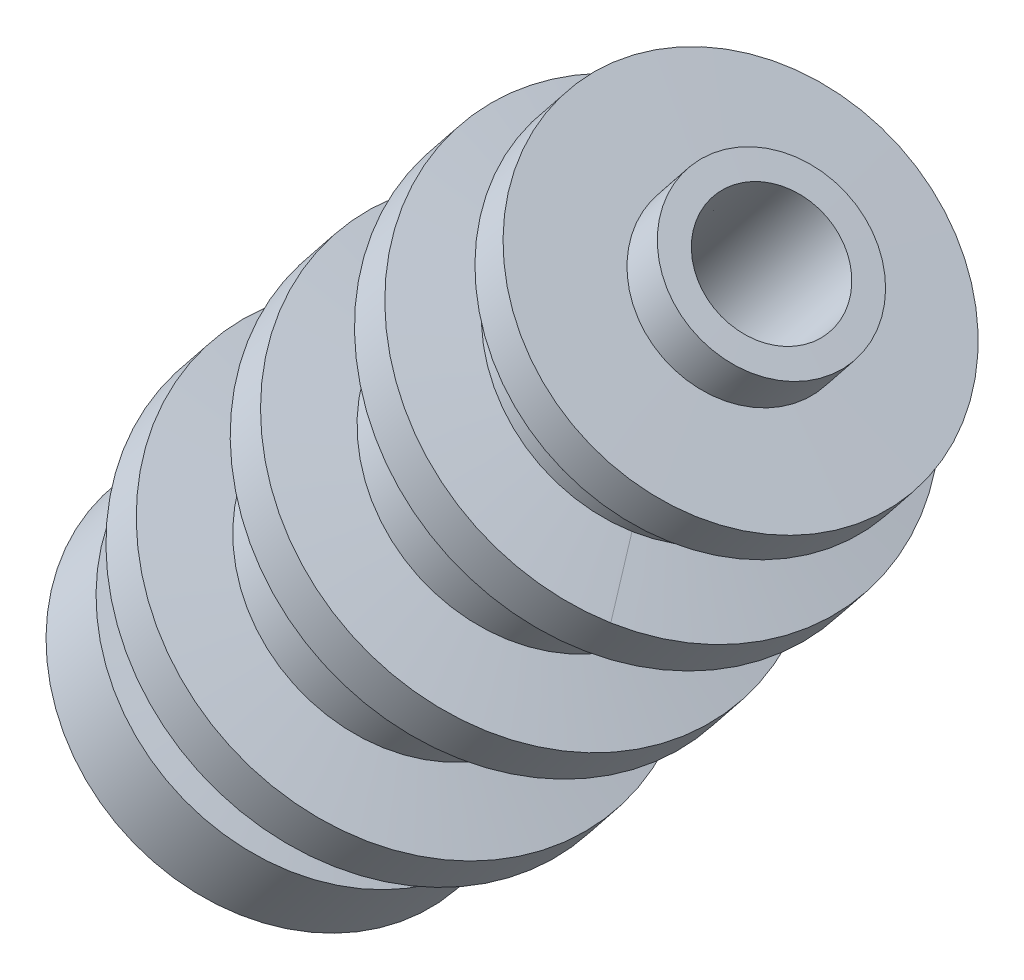
ISO-10303-21;
HEADER;
FILE_DESCRIPTION(('STEP AP214'),'2;1');
FILE_NAME('part.step','',(''),(''),'','','');
FILE_SCHEMA(('AUTOMOTIVE_DESIGN { 1 0 10303 214 1 1 1 1 }'));
ENDSEC;
DATA;
#1=APPLICATION_CONTEXT('core data for automotive mechanical design processes');
#2=APPLICATION_PROTOCOL_DEFINITION('international standard','automotive_design',2000,#1);
#3=PRODUCT_CONTEXT('',#1,'mechanical');
#4=PRODUCT('Part','Part','',(#3));
#5=PRODUCT_RELATED_PRODUCT_CATEGORY('part','',(#4));
#6=PRODUCT_DEFINITION_FORMATION('','',#4);
#7=PRODUCT_DEFINITION_CONTEXT('part definition',#1,'design');
#8=PRODUCT_DEFINITION('design','',#6,#7);
#9=PRODUCT_DEFINITION_SHAPE('','',#8);
#10=(LENGTH_UNIT() NAMED_UNIT(*) SI_UNIT(.MILLI.,.METRE.));
#11=(NAMED_UNIT(*) PLANE_ANGLE_UNIT() SI_UNIT($,.RADIAN.));
#12=(NAMED_UNIT(*) SI_UNIT($,.STERADIAN.) SOLID_ANGLE_UNIT());
#13=UNCERTAINTY_MEASURE_WITH_UNIT(LENGTH_MEASURE(1.E-05),#10,'distance_accuracy_value','');
#14=(GEOMETRIC_REPRESENTATION_CONTEXT(3) GLOBAL_UNCERTAINTY_ASSIGNED_CONTEXT((#13)) GLOBAL_UNIT_ASSIGNED_CONTEXT((#10,
#11,#12)) REPRESENTATION_CONTEXT('',''));
#15=CARTESIAN_POINT('',(0.,0.,0.));
#16=DIRECTION('',(0.,0.,1.));
#17=DIRECTION('',(1.,0.,0.));
#18=AXIS2_PLACEMENT_3D('',#15,#16,#17);
#19=CARTESIAN_POINT('',(-18.608083128768,15.1592131152266,0.));
#20=DIRECTION('',(0.623489801858733,0.78183148246803,0.));
#21=DIRECTION('',(-0.78183148246803,0.623489801858733,0.));
#22=AXIS2_PLACEMENT_3D('',#19,#20,#21);
#23=CYLINDRICAL_SURFACE('',#22,4.5);
#24=CARTESIAN_POINT('',(-19.0757004801884,14.5728395033425,0.));
#25=DIRECTION('',(0.623489801858733,0.78183148246803,0.));
#26=DIRECTION('',(-0.515541201884236,0.411130389375128,-0.751790577283337));
#27=AXIS2_PLACEMENT_3D('',#24,#25,#26);
#28=CIRCLE('',#27,4.49999999999749);
#29=CARTESIAN_POINT('',(-21.3956358886662,16.4229262555295,-3.38305759777313));
#30=VERTEX_POINT('',#29);
#31=EDGE_CURVE('E89',#30,#30,#28,.F.);
#32=ORIENTED_EDGE('',*,*,#31,.F.);
#33=EDGE_LOOP('',(#32));
#34=FACE_BOUND('',#33,.T.);
#35=CARTESIAN_POINT('',(-18.4522106782915,15.3546709858585,0.));
#36=DIRECTION('',(-0.623489801858733,-0.78183148246803,0.));
#37=DIRECTION('',(0.515541201881442,-0.411130389372898,0.751790577286472));
#38=AXIS2_PLACEMENT_3D('',#35,#36,#37);
#39=CIRCLE('',#38,4.50000000005434);
#40=CARTESIAN_POINT('',(-16.132275269797,13.5045842336581,3.38305759782998));
#41=VERTEX_POINT('',#40);
#42=EDGE_CURVE('E88',#41,#41,#39,.F.);
#43=ORIENTED_EDGE('',*,*,#42,.F.);
#44=EDGE_LOOP('',(#43));
#45=FACE_BOUND('',#44,.T.);
#46=ADVANCED_FACE('F17',(#34,#45),#23,.T.);
#47=CARTESIAN_POINT('',(-19.0757004801884,14.5728395033425,0.));
#48=DIRECTION('',(0.623489801858733,0.78183148246803,0.));
#49=DIRECTION('',(-0.78183148246803,0.623489801858733,0.));
#50=AXIS2_PLACEMENT_3D('',#47,#48,#49);
#51=CONICAL_SURFACE('',#50,4.49999999999749,1.48352986420031);
#52=ORIENTED_EDGE('',*,*,#31,.T.);
#53=EDGE_LOOP('',(#52));
#54=FACE_BOUND('',#53,.T.);
#55=CARTESIAN_POINT('',(-19.1575229143921,14.4702374161201,0.));
#56=DIRECTION('',(0.623489801858733,0.78183148246803,0.));
#57=DIRECTION('',(-0.78183148246803,0.623489801858733,0.));
#58=AXIS2_PLACEMENT_3D('',#55,#56,#57);
#59=CIRCLE('',#58,3.);
#60=CARTESIAN_POINT('',(-21.5030173617962,16.3407068216964,0.));
#61=VERTEX_POINT('',#60);
#62=EDGE_CURVE('E83',#61,#61,#59,.F.);
#63=ORIENTED_EDGE('',*,*,#62,.F.);
#64=EDGE_LOOP('',(#63));
#65=FACE_BOUND('',#64,.T.);
#66=ADVANCED_FACE('F347',(#54,#65),#51,.T.);
#67=CARTESIAN_POINT('',(-18.4522106783027,15.3546709858444,0.));
#68=DIRECTION('',(-0.623489801858733,-0.78183148246803,0.));
#69=DIRECTION('',(0.78183148246803,-0.623489801858733,0.));
#70=AXIS2_PLACEMENT_3D('',#67,#68,#69);
#71=CONICAL_SURFACE('',#70,4.50000000028789,1.48352986420075);
#72=CARTESIAN_POINT('',(-18.3703882440733,15.457273073099,0.));
#73=DIRECTION('',(0.623489801858733,0.78183148246803,0.));
#74=DIRECTION('',(-0.78183148246803,0.623489801858733,0.));
#75=AXIS2_PLACEMENT_3D('',#72,#73,#74);
#76=CIRCLE('',#75,3.);
#77=CARTESIAN_POINT('',(-20.7158826914774,17.3277424786752,0.));
#78=VERTEX_POINT('',#77);
#79=EDGE_CURVE('E80',#78,#78,#76,.T.);
#80=ORIENTED_EDGE('',*,*,#79,.F.);
#81=EDGE_LOOP('',(#80));
#82=FACE_BOUND('',#81,.T.);
#83=ORIENTED_EDGE('',*,*,#42,.T.);
#84=EDGE_LOOP('',(#83));
#85=FACE_BOUND('',#84,.T.);
#86=ADVANCED_FACE('F338',(#82,#85),#71,.T.);
#87=CARTESIAN_POINT('',(-21.3202637668535,11.7582461664907,0.));
#88=DIRECTION('',(0.623489801858733,0.78183148246803,0.));
#89=DIRECTION('',(-0.78183148246803,0.623489801858733,0.));
#90=AXIS2_PLACEMENT_3D('',#87,#88,#89);
#91=CYLINDRICAL_SURFACE('',#90,3.);
#92=ORIENTED_EDGE('',*,*,#62,.T.);
#93=EDGE_LOOP('',(#92));
#94=FACE_BOUND('',#93,.T.);
#95=CARTESIAN_POINT('',(-20.9266964316644,12.2517639950174,0.));
#96=DIRECTION('',(-0.623489801858733,-0.78183148246803,0.));
#97=DIRECTION('',(0.515541201890065,-0.411130389379777,0.751790577276798));
#98=AXIS2_PLACEMENT_3D('',#95,#96,#97);
#99=CIRCLE('',#98,3.00000000002442);
#100=CARTESIAN_POINT('',(-19.3800728259816,11.018372826868,2.25537173184875));
#101=VERTEX_POINT('',#100);
#102=EDGE_CURVE('E77',#101,#101,#99,.T.);
#103=ORIENTED_EDGE('',*,*,#102,.F.);
#104=EDGE_LOOP('',(#103));
#105=FACE_BOUND('',#104,.T.);
#106=ADVANCED_FACE('F329',(#94,#105),#91,.T.);
#107=CARTESIAN_POINT('',(-16.2076473916119,18.1692643227285,0.));
#108=DIRECTION('',(0.623489801858733,0.78183148246803,0.));
#109=DIRECTION('',(-0.78183148246803,0.623489801858733,0.));
#110=AXIS2_PLACEMENT_3D('',#107,#108,#109);
#111=CYLINDRICAL_SURFACE('',#110,3.);
#112=ORIENTED_EDGE('',*,*,#79,.T.);
#113=EDGE_LOOP('',(#112));
#114=FACE_BOUND('',#113,.T.);
#115=CARTESIAN_POINT('',(-16.6012147267878,17.6757464942183,0.));
#116=DIRECTION('',(0.623489801858733,0.78183148246803,0.));
#117=DIRECTION('',(-0.515541201892135,0.411130389381426,-0.751790577274476));
#118=AXIS2_PLACEMENT_3D('',#115,#116,#117);
#119=CIRCLE('',#118,3.00000000003368);
#120=CARTESIAN_POINT('',(-18.1478383324816,18.9091376623765,-2.25537173184875));
#121=VERTEX_POINT('',#120);
#122=EDGE_CURVE('E74',#121,#121,#119,.T.);
#123=ORIENTED_EDGE('',*,*,#122,.F.);
#124=EDGE_LOOP('',(#123));
#125=FACE_BOUND('',#124,.T.);
#126=ADVANCED_FACE('F320',(#114,#125),#111,.T.);
#127=CARTESIAN_POINT('',(-21.0085188658923,12.1491619077646,0.));
#128=DIRECTION('',(-0.623489801858734,-0.78183148246803,0.));
#129=DIRECTION('',(0.78183148246803,-0.623489801858733,0.));
#130=AXIS2_PLACEMENT_3D('',#127,#128,#129);
#131=CONICAL_SURFACE('',#130,4.50000000001816,1.48352986420031);
#132=CARTESIAN_POINT('',(-21.0085188659241,12.1491619077247,0.));
#133=DIRECTION('',(0.623489801858733,0.78183148246803,0.));
#134=DIRECTION('',(-0.78183148246803,0.623489801858733,0.));
#135=AXIS2_PLACEMENT_3D('',#132,#133,#134);
#136=CIRCLE('',#135,4.5);
#137=CARTESIAN_POINT('',(-24.5267605370303,14.954866016089,0.));
#138=VERTEX_POINT('',#137);
#139=EDGE_CURVE('E71',#138,#138,#136,.F.);
#140=ORIENTED_EDGE('',*,*,#139,.F.);
#141=EDGE_LOOP('',(#140));
#142=FACE_BOUND('',#141,.T.);
#143=ORIENTED_EDGE('',*,*,#102,.T.);
#144=EDGE_LOOP('',(#143));
#145=FACE_BOUND('',#144,.T.);
#146=ADVANCED_FACE('F311',(#142,#145),#131,.T.);
#147=CARTESIAN_POINT('',(-16.5193922925487,17.7783485814851,0.));
#148=DIRECTION('',(0.623489801858733,0.781831482468031,0.));
#149=DIRECTION('',(-0.78183148246803,0.623489801858733,0.));
#150=AXIS2_PLACEMENT_3D('',#147,#148,#149);
#151=CONICAL_SURFACE('',#150,4.50000000030371,1.48352986422428);
#152=ORIENTED_EDGE('',*,*,#122,.T.);
#153=EDGE_LOOP('',(#152));
#154=FACE_BOUND('',#153,.T.);
#155=CARTESIAN_POINT('',(-16.5193922925413,17.7783485814945,0.));
#156=DIRECTION('',(0.623489801858733,0.78183148246803,0.));
#157=DIRECTION('',(-0.78183148246803,0.623489801858733,0.));
#158=AXIS2_PLACEMENT_3D('',#155,#156,#157);
#159=CIRCLE('',#158,4.5);
#160=CARTESIAN_POINT('',(-20.0376339636474,20.5840526898588,0.));
#161=VERTEX_POINT('',#160);
#162=EDGE_CURVE('E68',#161,#161,#159,.T.);
#163=ORIENTED_EDGE('',*,*,#162,.F.);
#164=EDGE_LOOP('',(#163));
#165=FACE_BOUND('',#164,.T.);
#166=ADVANCED_FACE('F302',(#154,#165),#151,.T.);
#167=CARTESIAN_POINT('',(-21.3202637668535,11.7582461664907,0.));
#168=DIRECTION('',(0.623489801858733,0.78183148246803,0.));
#169=DIRECTION('',(-0.78183148246803,0.623489801858733,0.));
#170=AXIS2_PLACEMENT_3D('',#167,#168,#169);
#171=CYLINDRICAL_SURFACE('',#170,4.5);
#172=ORIENTED_EDGE('',*,*,#139,.T.);
#173=EDGE_LOOP('',(#172));
#174=FACE_BOUND('',#173,.T.);
#175=CARTESIAN_POINT('',(-21.6320086677892,11.3673304252487,0.));
#176=DIRECTION('',(0.623489801858733,0.78183148246803,0.));
#177=DIRECTION('',(-0.515541201878362,0.411130389370444,-0.751790577289926));
#178=AXIS2_PLACEMENT_3D('',#175,#176,#177);
#179=CIRCLE('',#178,4.50000000003367);
#180=CARTESIAN_POINT('',(-23.9519440762592,13.2174171774295,-3.38305759782998));
#181=VERTEX_POINT('',#180);
#182=EDGE_CURVE('E51',#181,#181,#179,.F.);
#183=ORIENTED_EDGE('',*,*,#182,.F.);
#184=EDGE_LOOP('',(#183));
#185=FACE_BOUND('',#184,.T.);
#186=ADVANCED_FACE('F293',(#174,#185),#171,.T.);
#187=CARTESIAN_POINT('',(-16.2076473916119,18.1692643227285,0.));
#188=DIRECTION('',(0.623489801858733,0.78183148246803,0.));
#189=DIRECTION('',(-0.78183148246803,0.623489801858733,0.));
#190=AXIS2_PLACEMENT_3D('',#187,#188,#189);
#191=CYLINDRICAL_SURFACE('',#190,4.5);
#192=ORIENTED_EDGE('',*,*,#162,.T.);
#193=EDGE_LOOP('',(#192));
#194=FACE_BOUND('',#193,.T.);
#195=CARTESIAN_POINT('',(-15.8959024906907,18.5601800639523,0.));
#196=DIRECTION('',(-0.623489801858733,-0.78183148246803,0.));
#197=DIRECTION('',(0.515541201890256,-0.411130389379927,0.751790577276584));
#198=AXIS2_PLACEMENT_3D('',#195,#196,#197);
#199=CIRCLE('',#198,4.49999999996231);
#200=CARTESIAN_POINT('',(-13.5759670822686,16.7100933118318,3.38305759766731));
#201=VERTEX_POINT('',#200);
#202=CARTESIAN_POINT('',(-18.2158378990928,20.4102668160926,-3.38305759770286));
#203=VERTEX_POINT('',#202);
#204=EDGE_CURVE('E54',#201,#203,#199,.F.);
#205=ORIENTED_EDGE('',*,*,#204,.F.);
#206=CARTESIAN_POINT('',(-15.8959024906907,18.5601800639523,0.));
#207=DIRECTION('',(-0.623489801858733,-0.78183148246803,0.));
#208=DIRECTION('',(0.515541201890256,-0.411130389379927,0.751790577276584));
#209=AXIS2_PLACEMENT_3D('',#206,#207,#208);
#210=CIRCLE('',#209,4.49999999996231);
#211=EDGE_CURVE('E44',#203,#201,#210,.F.);
#212=ORIENTED_EDGE('',*,*,#211,.F.);
#213=EDGE_LOOP('',(#205,#212));
#214=FACE_BOUND('',#213,.T.);
#215=ADVANCED_FACE('F57',(#194,#214),#191,.T.);
#216=CARTESIAN_POINT('',(-21.6320086678169,11.3673304252139,0.));
#217=DIRECTION('',(0.623489801858734,0.78183148246803,0.));
#218=DIRECTION('',(-0.78183148246803,0.623489801858733,0.));
#219=AXIS2_PLACEMENT_3D('',#216,#217,#218);
#220=CONICAL_SURFACE('',#219,4.49999999996757,1.48352986422428);
#221=ORIENTED_EDGE('',*,*,#182,.T.);
#222=EDGE_LOOP('',(#221));
#223=FACE_BOUND('',#222,.T.);
#224=CARTESIAN_POINT('',(-21.7138311020129,11.2647283380012,0.));
#225=DIRECTION('',(0.623489801858733,0.78183148246803,0.));
#226=DIRECTION('',(-0.78183148246803,0.623489801858733,0.));
#227=AXIS2_PLACEMENT_3D('',#224,#225,#226);
#228=CIRCLE('',#227,3.);
#229=CARTESIAN_POINT('',(-24.059325549417,13.1351977435774,0.));
#230=VERTEX_POINT('',#229);
#231=EDGE_CURVE('E58',#230,#230,#228,.F.);
#232=ORIENTED_EDGE('',*,*,#231,.F.);
#233=EDGE_LOOP('',(#232));
#234=FACE_BOUND('',#233,.T.);
#235=ADVANCED_FACE('F277',(#223,#234),#220,.T.);
#236=CARTESIAN_POINT('',(-15.8959024906907,18.5601800639523,0.));
#237=DIRECTION('',(-0.623489801858733,-0.78183148246803,0.));
#238=DIRECTION('',(0.78183148246803,-0.623489801858733,0.));
#239=AXIS2_PLACEMENT_3D('',#236,#237,#238);
#240=CONICAL_SURFACE('',#239,4.49999999996232,1.48352986419827);
#241=ORIENTED_EDGE('',*,*,#211,.T.);
#242=DIRECTION('',(-0.459238695190241,0.477707017676021,-0.748929787165023));
#243=VECTOR('',#242,1.);
#244=CARTESIAN_POINT('',(305967.784630716,-318269.716478548,499000.));
#245=LINE('',#244,#243);
#246=CARTESIAN_POINT('',(-14.2674564509426,17.4293909832198,2.25537173160036));
#247=VERTEX_POINT('',#246);
#248=EDGE_CURVE('E50',#247,#201,#245,.F.);
#249=ORIENTED_EDGE('',*,*,#248,.F.);
#250=CARTESIAN_POINT('',(-15.8140800564525,18.662782151218,0.));
#251=DIRECTION('',(0.623489801858733,0.78183148246803,0.));
#252=DIRECTION('',(-0.78183148246803,0.623489801858733,0.));
#253=AXIS2_PLACEMENT_3D('',#250,#251,#252);
#254=CIRCLE('',#253,3.);
#255=CARTESIAN_POINT('',(-17.3607036618794,19.8961733191522,-2.25537173153633));
#256=VERTEX_POINT('',#255);
#257=EDGE_CURVE('E61',#256,#247,#254,.T.);
#258=ORIENTED_EDGE('',*,*,#257,.F.);
#259=DIRECTION('',(0.567920128734235,-0.34142481055949,0.748929787171605));
#260=VECTOR('',#259,1.);
#261=CARTESIAN_POINT('',(-378411.795300954,227504.786411473,-499000.000004385));
#262=LINE('',#261,#260);
#263=EDGE_CURVE('E35',#203,#256,#262,.T.);
#264=ORIENTED_EDGE('',*,*,#263,.F.);
#265=EDGE_LOOP('',(#241,#249,#258,#264));
#266=FACE_BOUND('',#265,.T.);
#267=ADVANCED_FACE('F48',(#266),#240,.T.);
#268=CARTESIAN_POINT('',(-15.8959024906795,18.5601800639664,0.));
#269=DIRECTION('',(-0.623489801858733,-0.78183148246803,0.));
#270=DIRECTION('',(0.78183148246803,-0.623489801858733,0.));
#271=AXIS2_PLACEMENT_3D('',#268,#269,#270);
#272=CONICAL_SURFACE('',#271,4.49999999972876,1.48352986418);
#273=ORIENTED_EDGE('',*,*,#248,.T.);
#274=ORIENTED_EDGE('',*,*,#204,.T.);
#275=ORIENTED_EDGE('',*,*,#263,.T.);
#276=CARTESIAN_POINT('',(-15.8140800564525,18.662782151218,0.));
#277=DIRECTION('',(0.623489801858733,0.78183148246803,0.));
#278=DIRECTION('',(-0.78183148246803,0.623489801858733,0.));
#279=AXIS2_PLACEMENT_3D('',#276,#277,#278);
#280=CIRCLE('',#279,3.);
#281=EDGE_CURVE('E55',#247,#256,#280,.T.);
#282=ORIENTED_EDGE('',*,*,#281,.F.);
#283=EDGE_LOOP('',(#273,#274,#275,#282));
#284=FACE_BOUND('',#283,.T.);
#285=ADVANCED_FACE('F53',(#284),#272,.T.);
#286=CARTESIAN_POINT('',(-21.3202637668535,11.7582461664907,0.));
#287=DIRECTION('',(0.623489801858733,0.78183148246803,0.));
#288=DIRECTION('',(-0.78183148246803,0.623489801858733,0.));
#289=AXIS2_PLACEMENT_3D('',#286,#287,#288);
#290=CYLINDRICAL_SURFACE('',#289,3.);
#291=ORIENTED_EDGE('',*,*,#231,.T.);
#292=EDGE_LOOP('',(#291));
#293=FACE_BOUND('',#292,.T.);
#294=CARTESIAN_POINT('',(-22.6144007947702,10.1354496619824,0.));
#295=DIRECTION('',(-0.623489801858733,-0.78183148246803,0.));
#296=DIRECTION('',(0.515541201872486,-0.411130389365757,0.751790577296519));
#297=AXIS2_PLACEMENT_3D('',#294,#295,#296);
#298=CIRCLE('',#297,3.00000000009694);
#299=CARTESIAN_POINT('',(-21.0677771891028,8.90205849384529,2.25537173196244));
#300=VERTEX_POINT('',#299);
#301=EDGE_CURVE('E65',#300,#300,#298,.T.);
#302=ORIENTED_EDGE('',*,*,#301,.F.);
#303=EDGE_LOOP('',(#302));
#304=FACE_BOUND('',#303,.T.);
#305=ADVANCED_FACE('F128',(#293,#304),#290,.T.);
#306=CARTESIAN_POINT('',(-16.2076473916119,18.1692643227285,0.));
#307=DIRECTION('',(0.623489801858733,0.78183148246803,0.));
#308=DIRECTION('',(-0.78183148246803,0.623489801858733,0.));
#309=AXIS2_PLACEMENT_3D('',#306,#307,#308);
#310=CYLINDRICAL_SURFACE('',#309,3.);
#311=ORIENTED_EDGE('',*,*,#257,.T.);
#312=ORIENTED_EDGE('',*,*,#281,.T.);
#313=EDGE_LOOP('',(#311,#312));
#314=FACE_BOUND('',#313,.T.);
#315=CARTESIAN_POINT('',(-14.9135103637097,19.7920608272186,0.));
#316=DIRECTION('',(0.623489801858733,0.78183148246803,0.));
#317=DIRECTION('',(-0.515541201869335,0.411130389363243,-0.751790577300055));
#318=AXIS2_PLACEMENT_3D('',#315,#316,#317);
#319=CIRCLE('',#318,3.00000000008282);
#320=CARTESIAN_POINT('',(-16.4601339693604,21.0254519953423,-2.25537173196244));
#321=VERTEX_POINT('',#320);
#322=EDGE_CURVE('E118',#321,#321,#319,.T.);
#323=ORIENTED_EDGE('',*,*,#322,.F.);
#324=EDGE_LOOP('',(#323));
#325=FACE_BOUND('',#324,.T.);
#326=ADVANCED_FACE('F124',(#314,#325),#310,.T.);
#327=CARTESIAN_POINT('',(-22.6607668408429,10.077308479193,0.));
#328=DIRECTION('',(-0.623489801858734,-0.78183148246803,0.));
#329=DIRECTION('',(0.78183148246803,-0.623489801858734,0.));
#330=AXIS2_PLACEMENT_3D('',#327,#328,#329);
#331=CONICAL_SURFACE('',#330,3.85000000020552,1.483529864193);
#332=CARTESIAN_POINT('',(-22.6607668408498,10.0773084791844,0.));
#333=DIRECTION('',(0.623489801858733,0.78183148246803,0.));
#334=DIRECTION('',(-0.78183148246803,0.623489801858733,0.));
#335=AXIS2_PLACEMENT_3D('',#332,#333,#334);
#336=CIRCLE('',#335,3.85);
#337=CARTESIAN_POINT('',(-25.6708180483517,12.4777442163405,0.));
#338=VERTEX_POINT('',#337);
#339=EDGE_CURVE('E117',#338,#338,#336,.F.);
#340=ORIENTED_EDGE('',*,*,#339,.F.);
#341=EDGE_LOOP('',(#340));
#342=FACE_BOUND('',#341,.T.);
#343=ORIENTED_EDGE('',*,*,#301,.T.);
#344=EDGE_LOOP('',(#343));
#345=FACE_BOUND('',#344,.T.);
#346=ADVANCED_FACE('F127',(#342,#345),#331,.T.);
#347=CARTESIAN_POINT('',(-14.8671443176262,19.8502020100216,0.));
#348=DIRECTION('',(0.623489801858733,0.78183148246803,0.));
#349=DIRECTION('',(-0.78183148246803,0.623489801858733,0.));
#350=AXIS2_PLACEMENT_3D('',#347,#348,#349);
#351=CONICAL_SURFACE('',#350,3.84999999992854,1.4835298642038);
#352=ORIENTED_EDGE('',*,*,#322,.T.);
#353=EDGE_LOOP('',(#352));
#354=FACE_BOUND('',#353,.T.);
#355=CARTESIAN_POINT('',(-14.8671443176156,19.8502020100348,0.));
#356=DIRECTION('',(0.623489801858733,0.78183148246803,0.));
#357=DIRECTION('',(-0.78183148246803,0.623489801858733,0.));
#358=AXIS2_PLACEMENT_3D('',#355,#356,#357);
#359=CIRCLE('',#358,3.85);
#360=CARTESIAN_POINT('',(-17.8771955251175,22.2506377471909,0.));
#361=VERTEX_POINT('',#360);
#362=EDGE_CURVE('E112',#361,#361,#359,.T.);
#363=ORIENTED_EDGE('',*,*,#362,.F.);
#364=EDGE_LOOP('',(#363));
#365=FACE_BOUND('',#364,.T.);
#366=ADVANCED_FACE('F132',(#354,#365),#351,.T.);
#367=CARTESIAN_POINT('',(-23.2141211081754,9.3834241752817,0.));
#368=DIRECTION('',(0.623489801858733,0.78183148246803,0.));
#369=DIRECTION('',(-0.78183148246803,0.623489801858733,0.));
#370=AXIS2_PLACEMENT_3D('',#367,#368,#369);
#371=CYLINDRICAL_SURFACE('',#370,3.85);
#372=ORIENTED_EDGE('',*,*,#339,.T.);
#373=EDGE_LOOP('',(#372));
#374=FACE_BOUND('',#373,.T.);
#375=CARTESIAN_POINT('',(-23.6895250139167,8.78728653311216,0.));
#376=DIRECTION('',(0.623489801858733,0.78183148246803,0.));
#377=DIRECTION('',(-0.78183148246803,0.623489801858733,0.));
#378=AXIS2_PLACEMENT_3D('',#375,#376,#377);
#379=CIRCLE('',#378,3.85);
#380=CARTESIAN_POINT('',(-26.6995762214186,11.1877222702683,0.));
#381=VERTEX_POINT('',#380);
#382=EDGE_CURVE('E20',#381,#381,#379,.T.);
#383=ORIENTED_EDGE('',*,*,#382,.T.);
#384=EDGE_LOOP('',(#383));
#385=FACE_BOUND('',#384,.T.);
#386=ADVANCED_FACE('F135',(#374,#385),#371,.T.);
#387=CARTESIAN_POINT('',(-14.31379005029,20.5440863139375,0.));
#388=DIRECTION('',(0.623489801858733,0.78183148246803,0.));
#389=DIRECTION('',(-0.78183148246803,0.623489801858733,0.));
#390=AXIS2_PLACEMENT_3D('',#387,#388,#389);
#391=CYLINDRICAL_SURFACE('',#390,3.85);
#392=ORIENTED_EDGE('',*,*,#362,.T.);
#393=EDGE_LOOP('',(#392));
#394=FACE_BOUND('',#393,.T.);
#395=CARTESIAN_POINT('',(-14.2887038441404,20.5755434214715,0.));
#396=DIRECTION('',(-0.623489801858733,-0.78183148246803,0.));
#397=DIRECTION('',(0.515541201895156,-0.411130389383836,0.751790577271087));
#398=AXIS2_PLACEMENT_3D('',#395,#396,#397);
#399=CIRCLE('',#398,3.85000000000768);
#400=CARTESIAN_POINT('',(-12.3038702168401,18.9926914223406,2.89439372249944));
#401=VERTEX_POINT('',#400);
#402=EDGE_CURVE('E102',#401,#401,#399,.F.);
#403=ORIENTED_EDGE('',*,*,#402,.F.);
#404=EDGE_LOOP('',(#403));
#405=FACE_BOUND('',#404,.T.);
#406=ADVANCED_FACE('F139',(#394,#405),#391,.T.);
#407=CARTESIAN_POINT('',(-25.1588174392871,9.95900814283157,-2.14260314525709));
#408=DIRECTION('',(0.623489801858733,0.78183148246803,0.));
#409=DIRECTION('',(-0.78183148246803,0.623489801858733,0.));
#410=AXIS2_PLACEMENT_3D('',#407,#408,#409);
#411=PLANE('',#410);
#412=ORIENTED_EDGE('',*,*,#382,.F.);
#413=EDGE_LOOP('',(#412));
#414=FACE_BOUND('',#413,.T.);
#415=CARTESIAN_POINT('',(-23.6895250139167,8.78728653311216,0.));
#416=DIRECTION('',(0.623489801858733,0.78183148246803,0.));
#417=DIRECTION('',(-0.78183148246803,0.623489801858733,0.));
#418=AXIS2_PLACEMENT_3D('',#415,#416,#417);
#419=CIRCLE('',#418,2.85);
#420=CARTESIAN_POINT('',(-25.9177447389506,10.5642324684095,0.));
#421=VERTEX_POINT('',#420);
#422=EDGE_CURVE('E100',#421,#421,#419,.F.);
#423=ORIENTED_EDGE('',*,*,#422,.F.);
#424=EDGE_LOOP('',(#423));
#425=FACE_BOUND('',#424,.T.);
#426=ADVANCED_FACE('F142',(#414,#425),#411,.F.);
#427=CARTESIAN_POINT('',(-14.2887038441404,20.5755434214715,0.));
#428=DIRECTION('',(-0.623489801858733,-0.78183148246803,0.));
#429=DIRECTION('',(0.78183148246803,-0.623489801858733,0.));
#430=AXIS2_PLACEMENT_3D('',#427,#428,#429);
#431=CONICAL_SURFACE('',#430,3.85000000000768,1.56206968052302);
#432=CARTESIAN_POINT('',(-14.2778216180382,20.5891893013892,0.));
#433=DIRECTION('',(0.623489801858733,0.78183148246803,0.));
#434=DIRECTION('',(-0.78183148246803,0.623489801858733,0.));
#435=AXIS2_PLACEMENT_3D('',#432,#433,#434);
#436=CIRCLE('',#435,1.85);
#437=CARTESIAN_POINT('',(-15.724209860604,21.7426454348279,0.));
#438=VERTEX_POINT('',#437);
#439=EDGE_CURVE('E99',#438,#438,#436,.T.);
#440=ORIENTED_EDGE('',*,*,#439,.F.);
#441=EDGE_LOOP('',(#440));
#442=FACE_BOUND('',#441,.T.);
#443=ORIENTED_EDGE('',*,*,#402,.T.);
#444=EDGE_LOOP('',(#443));
#445=FACE_BOUND('',#444,.T.);
#446=ADVANCED_FACE('F149',(#442,#445),#431,.T.);
#447=CARTESIAN_POINT('',(-23.7557743394522,8.70421250649376,0.));
#448=DIRECTION('',(0.623489801858733,0.78183148246803,0.));
#449=DIRECTION('',(-0.78183148246803,0.623489801858733,0.));
#450=AXIS2_PLACEMENT_3D('',#447,#448,#449);
#451=CYLINDRICAL_SURFACE('',#450,2.85);
#452=ORIENTED_EDGE('',*,*,#422,.T.);
#453=EDGE_LOOP('',(#452));
#454=FACE_BOUND('',#453,.T.);
#455=CARTESIAN_POINT('',(-23.8765719544743,8.55273708837175,0.));
#456=DIRECTION('',(0.623489801858733,0.78183148246803,0.));
#457=DIRECTION('',(-0.78183148246803,0.623489801858733,0.));
#458=AXIS2_PLACEMENT_3D('',#455,#456,#457);
#459=CIRCLE('',#458,2.85);
#460=CARTESIAN_POINT('',(-26.1047916795082,10.3296830236691,0.));
#461=VERTEX_POINT('',#460);
#462=EDGE_CURVE('E97',#461,#461,#459,.T.);
#463=ORIENTED_EDGE('',*,*,#462,.T.);
#464=EDGE_LOOP('',(#463));
#465=FACE_BOUND('',#464,.T.);
#466=ADVANCED_FACE('F174',(#454,#465),#451,.T.);
#467=CARTESIAN_POINT('',(-13.9660767171088,20.9801050426232,0.));
#468=DIRECTION('',(0.623489801858733,0.78183148246803,0.));
#469=DIRECTION('',(-0.78183148246803,0.623489801858733,0.));
#470=AXIS2_PLACEMENT_3D('',#467,#468,#469);
#471=CYLINDRICAL_SURFACE('',#470,1.85);
#472=CARTESIAN_POINT('',(-13.6543318161789,21.371020783858,0.));
#473=DIRECTION('',(-0.623489801858733,-0.78183148246803,0.));
#474=DIRECTION('',(-0.587773541530378,0.468733758059643,0.659401947170404));
#475=AXIS2_PLACEMENT_3D('',#472,#473,#474);
#476=CIRCLE('',#475,1.84999999996183);
#477=CARTESIAN_POINT('',(-14.7417128679876,22.2381782362504,1.21989360224006));
#478=VERTEX_POINT('',#477);
#479=EDGE_CURVE('E96',#478,#478,#476,.F.);
#480=ORIENTED_EDGE('',*,*,#479,.F.);
#481=EDGE_LOOP('',(#480));
#482=FACE_BOUND('',#481,.T.);
#483=ORIENTED_EDGE('',*,*,#439,.T.);
#484=EDGE_LOOP('',(#483));
#485=FACE_BOUND('',#484,.T.);
#486=ADVANCED_FACE('F170',(#482,#485),#471,.T.);
#487=CARTESIAN_POINT('',(-24.546775516924,9.08720659455955,-0.977327750468138));
#488=DIRECTION('',(0.623489801858733,0.78183148246803,0.));
#489=DIRECTION('',(-0.78183148246803,0.623489801858733,0.));
#490=AXIS2_PLACEMENT_3D('',#487,#488,#489);
#491=PLANE('',#490);
#492=ORIENTED_EDGE('',*,*,#462,.F.);
#493=EDGE_LOOP('',(#492));
#494=FACE_BOUND('',#493,.T.);
#495=CARTESIAN_POINT('',(-23.8765719544305,8.55273708842663,0.));
#496=DIRECTION('',(-0.623489801858733,-0.78183148246803,0.));
#497=DIRECTION('',(0.78183148246803,-0.623489801858733,0.));
#498=AXIS2_PLACEMENT_3D('',#495,#496,#497);
#499=CIRCLE('',#498,1.3572470319872);
#500=CARTESIAN_POINT('',(-22.8154334953367,7.70650740537958,0.));
#501=VERTEX_POINT('',#500);
#502=EDGE_CURVE('E26',#501,#501,#499,.F.);
#503=ORIENTED_EDGE('',*,*,#502,.T.);
#504=EDGE_LOOP('',(#503));
#505=FACE_BOUND('',#504,.T.);
#506=ADVANCED_FACE('F162',(#494,#505),#491,.F.);
#507=CARTESIAN_POINT('',(-13.6543318161227,21.3710207839283,0.));
#508=DIRECTION('',(-0.623489801858732,-0.781831482468031,0.));
#509=DIRECTION('',(0.781831482468031,-0.623489801858732,0.));
#510=AXIS2_PLACEMENT_3D('',#507,#508,#509);
#511=CONICAL_SURFACE('',#510,1.84999999339563,1.56206968063833);
#512=ORIENTED_EDGE('',*,*,#479,.T.);
#513=EDGE_LOOP('',(#512));
#514=FACE_BOUND('',#513,.T.);
#515=CARTESIAN_POINT('',(-13.6513392039741,21.3747734008687,0.));
#516=DIRECTION('',(-0.623489801858733,-0.78183148246803,0.));
#517=DIRECTION('',(0.515541201896728,-0.411130389385019,0.751790577269361));
#518=AXIS2_PLACEMENT_3D('',#515,#516,#517);
#519=CIRCLE('',#518,1.30000000002359);
#520=CARTESIAN_POINT('',(-12.9811356414962,20.8403038946585,0.977327750467882));
#521=VERTEX_POINT('',#520);
#522=EDGE_CURVE('E11',#521,#521,#519,.T.);
#523=ORIENTED_EDGE('',*,*,#522,.T.);
#524=EDGE_LOOP('',(#523));
#525=FACE_BOUND('',#524,.T.);
#526=ADVANCED_FACE('F156',(#514,#525),#511,.T.);
#527=CARTESIAN_POINT('',(-23.8765719543706,8.55273708850181,0.));
#528=DIRECTION('',(-0.623489801858733,-0.78183148246803,0.));
#529=DIRECTION('',(0.78183148246803,-0.623489801858733,0.));
#530=AXIS2_PLACEMENT_3D('',#527,#528,#529);
#531=CONICAL_SURFACE('',#530,1.35724703198687,0.00349065850310866);
#532=ORIENTED_EDGE('',*,*,#522,.F.);
#533=EDGE_LOOP('',(#532));
#534=FACE_BOUND('',#533,.T.);
#535=ORIENTED_EDGE('',*,*,#502,.F.);
#536=EDGE_LOOP('',(#535));
#537=FACE_BOUND('',#536,.T.);
#538=ADVANCED_FACE('F154',(#534,#537),#531,.F.);
#539=CLOSED_SHELL('',(#46,#66,#86,#106,#126,#146,#166,#186,#215,#235,#267,#285,#305,#326,#346,
#366,#386,#406,#426,#446,#466,#486,#506,#526,#538));
#540=MANIFOLD_SOLID_BREP('B1',#539);
#541=ADVANCED_BREP_SHAPE_REPRESENTATION('',(#18,#540),#14);
#542=SHAPE_DEFINITION_REPRESENTATION(#9,#541);
ENDSEC;
END-ISO-10303-21;
